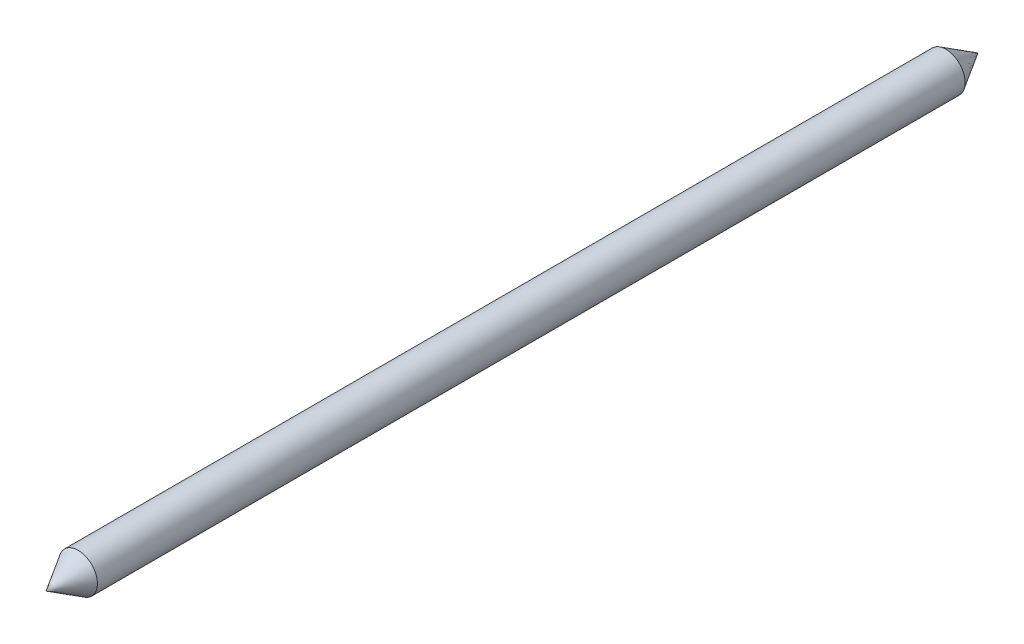
ISO-10303-21;
HEADER;
FILE_DESCRIPTION(('STEP AP214'),'2;1');
FILE_NAME('part.step','',(''),(''),'','','');
FILE_SCHEMA(('AUTOMOTIVE_DESIGN { 1 0 10303 214 1 1 1 1 }'));
ENDSEC;
DATA;
#1=APPLICATION_CONTEXT('core data for automotive mechanical design processes');
#2=APPLICATION_PROTOCOL_DEFINITION('international standard','automotive_design',2000,#1);
#3=PRODUCT_CONTEXT('',#1,'mechanical');
#4=PRODUCT('Part','Part','',(#3));
#5=PRODUCT_RELATED_PRODUCT_CATEGORY('part','',(#4));
#6=PRODUCT_DEFINITION_FORMATION('','',#4);
#7=PRODUCT_DEFINITION_CONTEXT('part definition',#1,'design');
#8=PRODUCT_DEFINITION('design','',#6,#7);
#9=PRODUCT_DEFINITION_SHAPE('','',#8);
#10=(LENGTH_UNIT() NAMED_UNIT(*) SI_UNIT(.MILLI.,.METRE.));
#11=(NAMED_UNIT(*) PLANE_ANGLE_UNIT() SI_UNIT($,.RADIAN.));
#12=(NAMED_UNIT(*) SI_UNIT($,.STERADIAN.) SOLID_ANGLE_UNIT());
#13=UNCERTAINTY_MEASURE_WITH_UNIT(LENGTH_MEASURE(1.E-05),#10,'distance_accuracy_value','');
#14=(GEOMETRIC_REPRESENTATION_CONTEXT(3) GLOBAL_UNCERTAINTY_ASSIGNED_CONTEXT((#13)) GLOBAL_UNIT_ASSIGNED_CONTEXT((#10,
#11,#12)) REPRESENTATION_CONTEXT('',''));
#15=CARTESIAN_POINT('',(0.,0.,0.));
#16=DIRECTION('',(0.,0.,1.));
#17=DIRECTION('',(1.,0.,0.));
#18=AXIS2_PLACEMENT_3D('',#15,#16,#17);
#19=CARTESIAN_POINT('',(0.,0.,-171.45));
#20=DIRECTION('',(0.,0.,1.));
#21=DIRECTION('',(1.,0.,0.));
#22=AXIS2_PLACEMENT_3D('',#19,#20,#21);
#23=CONICAL_SURFACE('',#22,7.6200000000001,0.540419500270589);
#24=CARTESIAN_POINT('',(0.,0.,-184.15));
#25=VERTEX_POINT('',#24);
#26=VERTEX_LOOP('',#25);
#27=FACE_BOUND('',#26,.T.);
#28=CARTESIAN_POINT('',(0.,0.,-171.45));
#29=DIRECTION('',(0.,0.,-1.));
#30=DIRECTION('',(-1.,0.,0.));
#31=AXIS2_PLACEMENT_3D('',#28,#29,#30);
#32=CIRCLE('',#31,7.6200000000001);
#33=CARTESIAN_POINT('',(-7.62000000000016,0.,-171.45));
#34=VERTEX_POINT('',#33);
#35=EDGE_CURVE('E11',#34,#34,#32,.T.);
#36=ORIENTED_EDGE('',*,*,#35,.T.);
#37=EDGE_LOOP('',(#36));
#38=FACE_BOUND('',#37,.T.);
#39=ADVANCED_FACE('F42',(#27,#38),#23,.T.);
#40=CARTESIAN_POINT('',(0.,0.,-184.15));
#41=DIRECTION('',(0.,0.,-1.));
#42=DIRECTION('',(-1.,0.,0.));
#43=AXIS2_PLACEMENT_3D('',#40,#41,#42);
#44=CYLINDRICAL_SURFACE('',#43,7.62000000000005);
#45=ORIENTED_EDGE('',*,*,#35,.F.);
#46=EDGE_LOOP('',(#45));
#47=FACE_BOUND('',#46,.T.);
#48=CARTESIAN_POINT('',(0.,0.,171.45));
#49=DIRECTION('',(0.,0.,-1.));
#50=DIRECTION('',(-1.,0.,0.));
#51=AXIS2_PLACEMENT_3D('',#48,#49,#50);
#52=CIRCLE('',#51,7.61999999999999);
#53=CARTESIAN_POINT('',(-7.61999999999995,0.,171.45));
#54=VERTEX_POINT('',#53);
#55=EDGE_CURVE('E49',#54,#54,#52,.T.);
#56=ORIENTED_EDGE('',*,*,#55,.T.);
#57=EDGE_LOOP('',(#56));
#58=FACE_BOUND('',#57,.T.);
#59=ADVANCED_FACE('F57',(#47,#58),#44,.T.);
#60=CARTESIAN_POINT('',(0.,0.,184.15));
#61=DIRECTION('',(0.,0.,-1.));
#62=DIRECTION('',(-1.,0.,0.));
#63=AXIS2_PLACEMENT_3D('',#60,#61,#62);
#64=CONICAL_SURFACE('',#63,0.,0.540419500270584);
#65=ORIENTED_EDGE('',*,*,#55,.F.);
#66=EDGE_LOOP('',(#65));
#67=FACE_BOUND('',#66,.T.);
#68=CARTESIAN_POINT('',(0.,0.,184.15));
#69=VERTEX_POINT('',#68);
#70=VERTEX_LOOP('',#69);
#71=FACE_BOUND('',#70,.T.);
#72=ADVANCED_FACE('F62',(#67,#71),#64,.T.);
#73=CLOSED_SHELL('',(#39,#59,#72));
#74=MANIFOLD_SOLID_BREP('B2',#73);
#75=ADVANCED_BREP_SHAPE_REPRESENTATION('',(#18,#74),#14);
#76=SHAPE_DEFINITION_REPRESENTATION(#9,#75);
ENDSEC;
END-ISO-10303-21;
